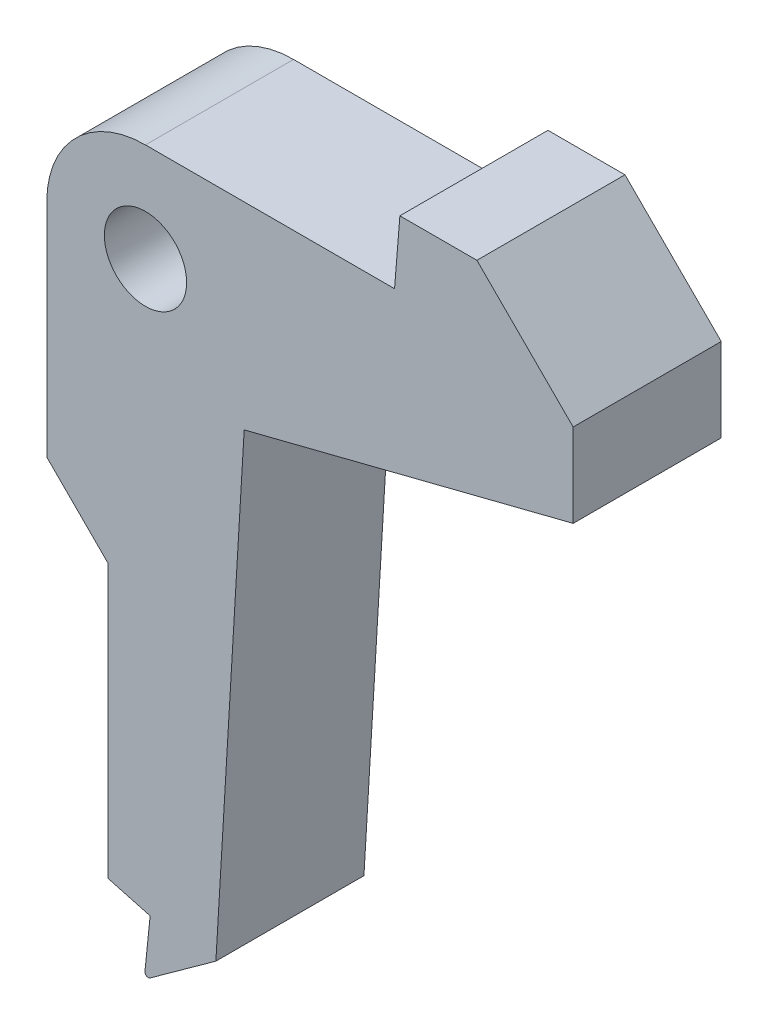
ISO-10303-21;
HEADER;
FILE_DESCRIPTION(('STEP AP214'),'2;1');
FILE_NAME('part.step','',(''),(''),'','','');
FILE_SCHEMA(('AUTOMOTIVE_DESIGN { 1 0 10303 214 1 1 1 1 }'));
ENDSEC;
DATA;
#1=APPLICATION_CONTEXT('core data for automotive mechanical design processes');
#2=APPLICATION_PROTOCOL_DEFINITION('international standard','automotive_design',2000,#1);
#3=PRODUCT_CONTEXT('',#1,'mechanical');
#4=PRODUCT('Part','Part','',(#3));
#5=PRODUCT_RELATED_PRODUCT_CATEGORY('part','',(#4));
#6=PRODUCT_DEFINITION_FORMATION('','',#4);
#7=PRODUCT_DEFINITION_CONTEXT('part definition',#1,'design');
#8=PRODUCT_DEFINITION('design','',#6,#7);
#9=PRODUCT_DEFINITION_SHAPE('','',#8);
#10=(LENGTH_UNIT() NAMED_UNIT(*) SI_UNIT(.MILLI.,.METRE.));
#11=(NAMED_UNIT(*) PLANE_ANGLE_UNIT() SI_UNIT($,.RADIAN.));
#12=(NAMED_UNIT(*) SI_UNIT($,.STERADIAN.) SOLID_ANGLE_UNIT());
#13=UNCERTAINTY_MEASURE_WITH_UNIT(LENGTH_MEASURE(1.E-05),#10,'distance_accuracy_value','');
#14=(GEOMETRIC_REPRESENTATION_CONTEXT(3) GLOBAL_UNCERTAINTY_ASSIGNED_CONTEXT((#13)) GLOBAL_UNIT_ASSIGNED_CONTEXT((#10,
#11,#12)) REPRESENTATION_CONTEXT('',''));
#15=CARTESIAN_POINT('',(0.,0.,0.));
#16=DIRECTION('',(0.,0.,1.));
#17=DIRECTION('',(1.,0.,0.));
#18=AXIS2_PLACEMENT_3D('',#15,#16,#17);
#19=CARTESIAN_POINT('',(0.165744471845361,-37.546161772189,9.));
#20=DIRECTION('',(0.,0.,-1.));
#21=DIRECTION('',(-1.,0.,0.));
#22=AXIS2_PLACEMENT_3D('',#19,#20,#21);
#23=CYLINDRICAL_SURFACE('',#22,0.200000000000002);
#24=CARTESIAN_POINT('',(0.165744471845361,-37.546161772189,0.));
#25=DIRECTION('',(0.,0.,1.));
#26=DIRECTION('',(1.,0.,0.));
#27=AXIS2_PLACEMENT_3D('',#24,#25,#26);
#28=CIRCLE('',#27,0.200000000000002);
#29=CARTESIAN_POINT('',(0.282693741661826,-37.708405010228,0.));
#30=VERTEX_POINT('',#29);
#31=CARTESIAN_POINT('',(-0.0332151986715307,-37.5257890083163,0.));
#32=VERTEX_POINT('',#31);
#33=EDGE_CURVE('E174',#30,#32,#28,.F.);
#34=ORIENTED_EDGE('',*,*,#33,.F.);
#35=DIRECTION('',(0.,0.,-1.));
#36=VECTOR('',#35,1.);
#37=CARTESIAN_POINT('',(0.282693741661826,-37.708405010228,9.));
#38=LINE('',#37,#36);
#39=CARTESIAN_POINT('',(0.282693741661826,-37.708405010228,9.));
#40=VERTEX_POINT('',#39);
#41=EDGE_CURVE('E11',#40,#30,#38,.T.);
#42=ORIENTED_EDGE('',*,*,#41,.F.);
#43=CARTESIAN_POINT('',(0.165744471845361,-37.546161772189,9.));
#44=DIRECTION('',(0.,0.,1.));
#45=DIRECTION('',(1.,0.,0.));
#46=AXIS2_PLACEMENT_3D('',#43,#44,#45);
#47=CIRCLE('',#46,0.200000000000002);
#48=CARTESIAN_POINT('',(-0.0332151986715307,-37.5257890083163,9.));
#49=VERTEX_POINT('',#48);
#50=EDGE_CURVE('E218',#40,#49,#47,.F.);
#51=ORIENTED_EDGE('',*,*,#50,.T.);
#52=DIRECTION('',(0.,0.,-1.));
#53=VECTOR('',#52,1.);
#54=CARTESIAN_POINT('',(-0.0332151986715307,-37.5257890083163,9.));
#55=LINE('',#54,#53);
#56=EDGE_CURVE('E51',#49,#32,#55,.T.);
#57=ORIENTED_EDGE('',*,*,#56,.T.);
#58=EDGE_LOOP('',(#34,#42,#51,#57));
#59=FACE_BOUND('',#58,.T.);
#60=ADVANCED_FACE('F35',(#59),#23,.T.);
#61=CARTESIAN_POINT('',(17.9838580516178,-24.9489318514621,9.));
#62=DIRECTION('',(0.584746349082306,-0.811216190195261,0.));
#63=DIRECTION('',(0.811216190195261,0.584746349082306,0.));
#64=AXIS2_PLACEMENT_3D('',#61,#62,#63);
#65=PLANE('',#64);
#66=DIRECTION('',(-0.811216190195261,-0.584746349082306,0.));
#67=VECTOR('',#66,1.);
#68=CARTESIAN_POINT('',(17.9838580516178,-24.9489318514621,0.));
#69=LINE('',#68,#67);
#70=CARTESIAN_POINT('',(4.27839011788118,-34.8282000830147,0.));
#71=VERTEX_POINT('',#70);
#72=EDGE_CURVE('E176',#71,#30,#69,.T.);
#73=ORIENTED_EDGE('',*,*,#72,.F.);
#74=DIRECTION('',(0.,0.,-1.));
#75=VECTOR('',#74,1.);
#76=CARTESIAN_POINT('',(4.27839011788118,-34.8282000830147,9.));
#77=LINE('',#76,#75);
#78=CARTESIAN_POINT('',(4.27839011788118,-34.8282000830147,9.));
#79=VERTEX_POINT('',#78);
#80=EDGE_CURVE('E43',#79,#71,#77,.T.);
#81=ORIENTED_EDGE('',*,*,#80,.F.);
#82=DIRECTION('',(-0.811216190195261,-0.584746349082306,0.));
#83=VECTOR('',#82,1.);
#84=CARTESIAN_POINT('',(17.9838580516178,-24.9489318514621,9.));
#85=LINE('',#84,#83);
#86=EDGE_CURVE('E262',#79,#40,#85,.T.);
#87=ORIENTED_EDGE('',*,*,#86,.T.);
#88=ORIENTED_EDGE('',*,*,#41,.T.);
#89=EDGE_LOOP('',(#73,#81,#87,#88));
#90=FACE_BOUND('',#89,.T.);
#91=ADVANCED_FACE('F249',(#90),#65,.T.);
#92=CARTESIAN_POINT('',(6.33572192455357,-0.378367065729331,9.));
#93=DIRECTION('',(0.998221537653518,-0.0596134361083714,0.));
#94=DIRECTION('',(0.0596134361083714,0.998221537653518,0.));
#95=AXIS2_PLACEMENT_3D('',#92,#93,#94);
#96=PLANE('',#95);
#97=DIRECTION('',(-0.0596134361083714,-0.998221537653518,0.));
#98=VECTOR('',#97,1.);
#99=CARTESIAN_POINT('',(6.33572192455357,-0.378367065729331,0.));
#100=LINE('',#99,#98);
#101=CARTESIAN_POINT('',(6.,-6.,0.));
#102=VERTEX_POINT('',#101);
#103=EDGE_CURVE('E179',#102,#71,#100,.T.);
#104=ORIENTED_EDGE('',*,*,#103,.F.);
#105=DIRECTION('',(0.,0.,-1.));
#106=VECTOR('',#105,1.);
#107=CARTESIAN_POINT('',(6.,-6.,9.));
#108=LINE('',#107,#106);
#109=CARTESIAN_POINT('',(6.,-6.,9.));
#110=VERTEX_POINT('',#109);
#111=EDGE_CURVE('E238',#110,#102,#108,.T.);
#112=ORIENTED_EDGE('',*,*,#111,.F.);
#113=DIRECTION('',(-0.0596134361083714,-0.998221537653518,0.));
#114=VECTOR('',#113,1.);
#115=CARTESIAN_POINT('',(6.33572192455357,-0.378367065729331,9.));
#116=LINE('',#115,#114);
#117=EDGE_CURVE('E245',#110,#79,#116,.T.);
#118=ORIENTED_EDGE('',*,*,#117,.T.);
#119=ORIENTED_EDGE('',*,*,#80,.T.);
#120=EDGE_LOOP('',(#104,#112,#118,#119));
#121=FACE_BOUND('',#120,.T.);
#122=ADVANCED_FACE('F243',(#121),#96,.T.);
#123=CARTESIAN_POINT('',(1.79375265795441,-7.06755053438896,9.));
#124=DIRECTION('',(0.246001714690068,-0.969269393084062,0.));
#125=DIRECTION('',(0.969269393084062,0.246001714690068,0.));
#126=AXIS2_PLACEMENT_3D('',#123,#124,#125);
#127=PLANE('',#126);
#128=DIRECTION('',(-0.969269393084062,-0.246001714690068,0.));
#129=VECTOR('',#128,1.);
#130=CARTESIAN_POINT('',(1.79375265795441,-7.06755053438896,0.));
#131=LINE('',#130,#129);
#132=CARTESIAN_POINT('',(25.9952904843054,-0.925171701528675,0.));
#133=VERTEX_POINT('',#132);
#134=EDGE_CURVE('E182',#133,#102,#131,.T.);
#135=ORIENTED_EDGE('',*,*,#134,.F.);
#136=DIRECTION('',(0.,0.,-1.));
#137=VECTOR('',#136,1.);
#138=CARTESIAN_POINT('',(25.9952904843054,-0.925171701528675,9.));
#139=LINE('',#138,#137);
#140=CARTESIAN_POINT('',(25.9952904843054,-0.925171701528675,9.));
#141=VERTEX_POINT('',#140);
#142=EDGE_CURVE('E236',#141,#133,#139,.T.);
#143=ORIENTED_EDGE('',*,*,#142,.F.);
#144=DIRECTION('',(-0.969269393084062,-0.246001714690068,0.));
#145=VECTOR('',#144,1.);
#146=CARTESIAN_POINT('',(1.79375265795441,-7.06755053438896,9.));
#147=LINE('',#146,#145);
#148=EDGE_CURVE('E259',#141,#110,#147,.T.);
#149=ORIENTED_EDGE('',*,*,#148,.T.);
#150=ORIENTED_EDGE('',*,*,#111,.T.);
#151=EDGE_LOOP('',(#135,#143,#149,#150));
#152=FACE_BOUND('',#151,.T.);
#153=ADVANCED_FACE('F256',(#152),#127,.T.);
#154=CARTESIAN_POINT('',(25.9952904843054,1.7771888235724E-13,9.));
#155=DIRECTION('',(1.,0.,0.));
#156=DIRECTION('',(0.,1.,0.));
#157=AXIS2_PLACEMENT_3D('',#154,#155,#156);
#158=PLANE('',#157);
#159=DIRECTION('',(0.,-1.,0.));
#160=VECTOR('',#159,1.);
#161=CARTESIAN_POINT('',(25.9952904843054,1.7771888235724E-13,0.));
#162=LINE('',#161,#160);
#163=CARTESIAN_POINT('',(25.9952904843053,4.14965659694265,0.));
#164=VERTEX_POINT('',#163);
#165=EDGE_CURVE('E185',#164,#133,#162,.T.);
#166=ORIENTED_EDGE('',*,*,#165,.F.);
#167=DIRECTION('',(0.,0.,-1.));
#168=VECTOR('',#167,1.);
#169=CARTESIAN_POINT('',(25.9952904843053,4.14965659694265,9.));
#170=LINE('',#169,#168);
#171=CARTESIAN_POINT('',(25.9952904843053,4.14965659694265,9.));
#172=VERTEX_POINT('',#171);
#173=EDGE_CURVE('E234',#172,#164,#170,.T.);
#174=ORIENTED_EDGE('',*,*,#173,.F.);
#175=DIRECTION('',(0.,-1.,0.));
#176=VECTOR('',#175,1.);
#177=CARTESIAN_POINT('',(25.9952904843054,1.7771888235724E-13,9.));
#178=LINE('',#177,#176);
#179=EDGE_CURVE('E264',#172,#141,#178,.T.);
#180=ORIENTED_EDGE('',*,*,#179,.T.);
#181=ORIENTED_EDGE('',*,*,#142,.T.);
#182=EDGE_LOOP('',(#166,#174,#180,#181));
#183=FACE_BOUND('',#182,.T.);
#184=ADVANCED_FACE('F312',(#183),#158,.T.);
#185=CARTESIAN_POINT('',(15.072473540624,15.072473540624,9.));
#186=DIRECTION('',(0.707106781186547,0.707106781186548,0.));
#187=DIRECTION('',(-0.707106781186548,0.707106781186547,0.));
#188=AXIS2_PLACEMENT_3D('',#185,#186,#187);
#189=PLANE('',#188);
#190=DIRECTION('',(0.707106781186548,-0.707106781186547,0.));
#191=VECTOR('',#190,1.);
#192=CARTESIAN_POINT('',(15.072473540624,15.072473540624,0.));
#193=LINE('',#192,#191);
#194=CARTESIAN_POINT('',(20.144947081248,10.,0.));
#195=VERTEX_POINT('',#194);
#196=EDGE_CURVE('E188',#195,#164,#193,.T.);
#197=ORIENTED_EDGE('',*,*,#196,.F.);
#198=DIRECTION('',(0.,0.,-1.));
#199=VECTOR('',#198,1.);
#200=CARTESIAN_POINT('',(20.144947081248,10.,9.));
#201=LINE('',#200,#199);
#202=CARTESIAN_POINT('',(20.144947081248,10.,9.));
#203=VERTEX_POINT('',#202);
#204=EDGE_CURVE('E232',#203,#195,#201,.T.);
#205=ORIENTED_EDGE('',*,*,#204,.F.);
#206=DIRECTION('',(0.707106781186548,-0.707106781186547,0.));
#207=VECTOR('',#206,1.);
#208=CARTESIAN_POINT('',(15.072473540624,15.072473540624,9.));
#209=LINE('',#208,#207);
#210=EDGE_CURVE('E270',#203,#172,#209,.T.);
#211=ORIENTED_EDGE('',*,*,#210,.T.);
#212=ORIENTED_EDGE('',*,*,#173,.T.);
#213=EDGE_LOOP('',(#197,#205,#211,#212));
#214=FACE_BOUND('',#213,.T.);
#215=ADVANCED_FACE('F315',(#214),#189,.T.);
#216=CARTESIAN_POINT('',(0.,10.,9.));
#217=DIRECTION('',(0.,1.,0.));
#218=DIRECTION('',(0.,0.,1.));
#219=AXIS2_PLACEMENT_3D('',#216,#217,#218);
#220=PLANE('',#219);
#221=DIRECTION('',(1.,0.,0.));
#222=VECTOR('',#221,1.);
#223=CARTESIAN_POINT('',(0.,10.,0.));
#224=LINE('',#223,#222);
#225=CARTESIAN_POINT('',(15.4624481322685,10.,0.));
#226=VERTEX_POINT('',#225);
#227=EDGE_CURVE('E191',#226,#195,#224,.T.);
#228=ORIENTED_EDGE('',*,*,#227,.F.);
#229=DIRECTION('',(0.,0.,-1.));
#230=VECTOR('',#229,1.);
#231=CARTESIAN_POINT('',(15.4624481322685,10.,9.));
#232=LINE('',#231,#230);
#233=CARTESIAN_POINT('',(15.4624481322685,10.,9.));
#234=VERTEX_POINT('',#233);
#235=EDGE_CURVE('E230',#234,#226,#232,.T.);
#236=ORIENTED_EDGE('',*,*,#235,.F.);
#237=DIRECTION('',(1.,0.,0.));
#238=VECTOR('',#237,1.);
#239=CARTESIAN_POINT('',(0.,10.,9.));
#240=LINE('',#239,#238);
#241=EDGE_CURVE('E273',#234,#203,#240,.T.);
#242=ORIENTED_EDGE('',*,*,#241,.T.);
#243=ORIENTED_EDGE('',*,*,#204,.T.);
#244=EDGE_LOOP('',(#228,#236,#242,#243));
#245=FACE_BOUND('',#244,.T.);
#246=ADVANCED_FACE('F319',(#245),#220,.T.);
#247=CARTESIAN_POINT('',(14.5561035103779,-1.18003609474193,9.));
#248=DIRECTION('',(-0.996730087833297,0.0808030445455417,0.));
#249=DIRECTION('',(-0.0808030445455417,-0.996730087833297,0.));
#250=AXIS2_PLACEMENT_3D('',#247,#248,#249);
#251=PLANE('',#250);
#252=DIRECTION('',(0.0808030445455417,0.996730087833297,0.));
#253=VECTOR('',#252,1.);
#254=CARTESIAN_POINT('',(14.5561035103779,-1.18003609474193,0.));
#255=LINE('',#254,#253);
#256=CARTESIAN_POINT('',(15.1381756114251,6.,0.));
#257=VERTEX_POINT('',#256);
#258=EDGE_CURVE('E194',#257,#226,#255,.T.);
#259=ORIENTED_EDGE('',*,*,#258,.F.);
#260=DIRECTION('',(0.,0.,-1.));
#261=VECTOR('',#260,1.);
#262=CARTESIAN_POINT('',(15.1381756114251,6.,9.));
#263=LINE('',#262,#261);
#264=CARTESIAN_POINT('',(15.1381756114251,6.,9.));
#265=VERTEX_POINT('',#264);
#266=EDGE_CURVE('E228',#265,#257,#263,.T.);
#267=ORIENTED_EDGE('',*,*,#266,.F.);
#268=DIRECTION('',(0.0808030445455417,0.996730087833297,0.));
#269=VECTOR('',#268,1.);
#270=CARTESIAN_POINT('',(14.5561035103779,-1.18003609474193,9.));
#271=LINE('',#270,#269);
#272=EDGE_CURVE('E276',#265,#234,#271,.T.);
#273=ORIENTED_EDGE('',*,*,#272,.T.);
#274=ORIENTED_EDGE('',*,*,#235,.T.);
#275=EDGE_LOOP('',(#259,#267,#273,#274));
#276=FACE_BOUND('',#275,.T.);
#277=ADVANCED_FACE('F323',(#276),#251,.T.);
#278=CARTESIAN_POINT('',(0.,6.,9.));
#279=DIRECTION('',(0.,1.,0.));
#280=DIRECTION('',(0.,0.,1.));
#281=AXIS2_PLACEMENT_3D('',#278,#279,#280);
#282=PLANE('',#281);
#283=DIRECTION('',(1.,0.,0.));
#284=VECTOR('',#283,1.);
#285=CARTESIAN_POINT('',(0.,6.,0.));
#286=LINE('',#285,#284);
#287=CARTESIAN_POINT('',(0.,6.,0.));
#288=VERTEX_POINT('',#287);
#289=EDGE_CURVE('E197',#288,#257,#286,.T.);
#290=ORIENTED_EDGE('',*,*,#289,.F.);
#291=DIRECTION('',(0.,0.,-1.));
#292=VECTOR('',#291,1.);
#293=CARTESIAN_POINT('',(0.,6.,9.));
#294=LINE('',#293,#292);
#295=CARTESIAN_POINT('',(0.,6.,9.));
#296=VERTEX_POINT('',#295);
#297=EDGE_CURVE('E226',#296,#288,#294,.T.);
#298=ORIENTED_EDGE('',*,*,#297,.F.);
#299=DIRECTION('',(1.,0.,0.));
#300=VECTOR('',#299,1.);
#301=CARTESIAN_POINT('',(0.,6.,9.));
#302=LINE('',#301,#300);
#303=EDGE_CURVE('E279',#296,#265,#302,.T.);
#304=ORIENTED_EDGE('',*,*,#303,.T.);
#305=ORIENTED_EDGE('',*,*,#266,.T.);
#306=EDGE_LOOP('',(#290,#298,#304,#305));
#307=FACE_BOUND('',#306,.T.);
#308=ADVANCED_FACE('F327',(#307),#282,.T.);
#309=CARTESIAN_POINT('',(0.,0.,9.));
#310=DIRECTION('',(0.,0.,-1.));
#311=DIRECTION('',(-1.,0.,0.));
#312=AXIS2_PLACEMENT_3D('',#309,#310,#311);
#313=CYLINDRICAL_SURFACE('',#312,6.);
#314=CARTESIAN_POINT('',(0.,0.,0.));
#315=DIRECTION('',(0.,0.,1.));
#316=DIRECTION('',(1.,0.,0.));
#317=AXIS2_PLACEMENT_3D('',#314,#315,#316);
#318=CIRCLE('',#317,6.);
#319=CARTESIAN_POINT('',(-6.,0.,0.));
#320=VERTEX_POINT('',#319);
#321=EDGE_CURVE('E200',#288,#320,#318,.T.);
#322=ORIENTED_EDGE('',*,*,#321,.T.);
#323=DIRECTION('',(0.,0.,-1.));
#324=VECTOR('',#323,1.);
#325=CARTESIAN_POINT('',(-6.,0.,9.));
#326=LINE('',#325,#324);
#327=CARTESIAN_POINT('',(-6.,0.,9.));
#328=VERTEX_POINT('',#327);
#329=EDGE_CURVE('E224',#328,#320,#326,.T.);
#330=ORIENTED_EDGE('',*,*,#329,.F.);
#331=CARTESIAN_POINT('',(0.,0.,9.));
#332=DIRECTION('',(0.,0.,1.));
#333=DIRECTION('',(1.,0.,0.));
#334=AXIS2_PLACEMENT_3D('',#331,#332,#333);
#335=CIRCLE('',#334,6.);
#336=EDGE_CURVE('E282',#296,#328,#335,.T.);
#337=ORIENTED_EDGE('',*,*,#336,.F.);
#338=ORIENTED_EDGE('',*,*,#297,.T.);
#339=EDGE_LOOP('',(#322,#330,#337,#338));
#340=FACE_BOUND('',#339,.T.);
#341=ADVANCED_FACE('F331',(#340),#313,.T.);
#342=CARTESIAN_POINT('',(-6.,0.,9.));
#343=DIRECTION('',(-1.,0.,0.));
#344=DIRECTION('',(0.,0.,1.));
#345=AXIS2_PLACEMENT_3D('',#342,#343,#344);
#346=PLANE('',#345);
#347=DIRECTION('',(0.,1.,0.));
#348=VECTOR('',#347,1.);
#349=CARTESIAN_POINT('',(-6.,0.,0.));
#350=LINE('',#349,#348);
#351=CARTESIAN_POINT('',(-6.,-13.4332762829089,0.));
#352=VERTEX_POINT('',#351);
#353=EDGE_CURVE('E203',#352,#320,#350,.T.);
#354=ORIENTED_EDGE('',*,*,#353,.F.);
#355=DIRECTION('',(0.,0.,-1.));
#356=VECTOR('',#355,1.);
#357=CARTESIAN_POINT('',(-6.,-13.4332762829089,9.));
#358=LINE('',#357,#356);
#359=CARTESIAN_POINT('',(-6.,-13.4332762829089,9.));
#360=VERTEX_POINT('',#359);
#361=EDGE_CURVE('E222',#360,#352,#358,.T.);
#362=ORIENTED_EDGE('',*,*,#361,.F.);
#363=DIRECTION('',(0.,1.,0.));
#364=VECTOR('',#363,1.);
#365=CARTESIAN_POINT('',(-6.,0.,9.));
#366=LINE('',#365,#364);
#367=EDGE_CURVE('E284',#360,#328,#366,.T.);
#368=ORIENTED_EDGE('',*,*,#367,.T.);
#369=ORIENTED_EDGE('',*,*,#329,.T.);
#370=EDGE_LOOP('',(#354,#362,#368,#369));
#371=FACE_BOUND('',#370,.T.);
#372=ADVANCED_FACE('F335',(#371),#346,.T.);
#373=CARTESIAN_POINT('',(-9.71663814145445,-9.71663814145445,9.));
#374=DIRECTION('',(-0.707106781186547,-0.707106781186547,0.));
#375=DIRECTION('',(0.707106781186548,-0.707106781186548,0.));
#376=AXIS2_PLACEMENT_3D('',#373,#374,#375);
#377=PLANE('',#376);
#378=DIRECTION('',(-0.707106781186548,0.707106781186548,0.));
#379=VECTOR('',#378,1.);
#380=CARTESIAN_POINT('',(-9.71663814145445,-9.71663814145445,0.));
#381=LINE('',#380,#379);
#382=CARTESIAN_POINT('',(-2.27208982740734,-17.1611864555016,0.));
#383=VERTEX_POINT('',#382);
#384=EDGE_CURVE('E206',#383,#352,#381,.T.);
#385=ORIENTED_EDGE('',*,*,#384,.F.);
#386=DIRECTION('',(0.,0.,-1.));
#387=VECTOR('',#386,1.);
#388=CARTESIAN_POINT('',(-2.27208982740734,-17.1611864555016,9.));
#389=LINE('',#388,#387);
#390=CARTESIAN_POINT('',(-2.27208982740734,-17.1611864555016,9.));
#391=VERTEX_POINT('',#390);
#392=EDGE_CURVE('E152',#391,#383,#389,.T.);
#393=ORIENTED_EDGE('',*,*,#392,.F.);
#394=DIRECTION('',(-0.707106781186548,0.707106781186548,0.));
#395=VECTOR('',#394,1.);
#396=CARTESIAN_POINT('',(-9.71663814145445,-9.71663814145445,9.));
#397=LINE('',#396,#395);
#398=EDGE_CURVE('E163',#391,#360,#397,.T.);
#399=ORIENTED_EDGE('',*,*,#398,.T.);
#400=ORIENTED_EDGE('',*,*,#361,.T.);
#401=EDGE_LOOP('',(#385,#393,#399,#400));
#402=FACE_BOUND('',#401,.T.);
#403=ADVANCED_FACE('F288',(#402),#377,.T.);
#404=CARTESIAN_POINT('',(-2.27208982740734,0.,9.));
#405=DIRECTION('',(-1.,0.,0.));
#406=DIRECTION('',(0.,0.,1.));
#407=AXIS2_PLACEMENT_3D('',#404,#405,#406);
#408=PLANE('',#407);
#409=DIRECTION('',(0.,1.,0.));
#410=VECTOR('',#409,1.);
#411=CARTESIAN_POINT('',(-2.27208982740734,0.,0.));
#412=LINE('',#411,#410);
#413=CARTESIAN_POINT('',(-2.27208982740734,-33.7477038311711,0.));
#414=VERTEX_POINT('',#413);
#415=EDGE_CURVE('E148',#414,#383,#412,.T.);
#416=ORIENTED_EDGE('',*,*,#415,.F.);
#417=DIRECTION('',(0.,0.,-1.));
#418=VECTOR('',#417,1.);
#419=CARTESIAN_POINT('',(-2.27208982740734,-33.7477038311711,9.));
#420=LINE('',#419,#418);
#421=CARTESIAN_POINT('',(-2.27208982740734,-33.7477038311711,9.));
#422=VERTEX_POINT('',#421);
#423=EDGE_CURVE('E143',#422,#414,#420,.T.);
#424=ORIENTED_EDGE('',*,*,#423,.F.);
#425=DIRECTION('',(0.,1.,0.));
#426=VECTOR('',#425,1.);
#427=CARTESIAN_POINT('',(-2.27208982740734,0.,9.));
#428=LINE('',#427,#426);
#429=EDGE_CURVE('E146',#422,#391,#428,.T.);
#430=ORIENTED_EDGE('',*,*,#429,.T.);
#431=ORIENTED_EDGE('',*,*,#392,.T.);
#432=EDGE_LOOP('',(#416,#424,#430,#431));
#433=FACE_BOUND('',#432,.T.);
#434=ADVANCED_FACE('F145',(#433),#408,.T.);
#435=CARTESIAN_POINT('',(-8.68180708409066,-32.0092062154696,9.));
#436=DIRECTION('',(-0.261770728516274,-0.965130087445241,0.));
#437=DIRECTION('',(0.965130087445241,-0.261770728516274,0.));
#438=AXIS2_PLACEMENT_3D('',#435,#436,#437);
#439=PLANE('',#438);
#440=DIRECTION('',(-0.965130087445241,0.261770728516274,0.));
#441=VECTOR('',#440,1.);
#442=CARTESIAN_POINT('',(-8.68180708409066,-32.0092062154696,0.));
#443=LINE('',#442,#441);
#444=CARTESIAN_POINT('',(0.282693741661824,-34.4406337944747,0.));
#445=VERTEX_POINT('',#444);
#446=EDGE_CURVE('E210',#445,#414,#443,.T.);
#447=ORIENTED_EDGE('',*,*,#446,.F.);
#448=DIRECTION('',(0.,0.,-1.));
#449=VECTOR('',#448,1.);
#450=CARTESIAN_POINT('',(0.282693741661824,-34.4406337944747,9.));
#451=LINE('',#450,#449);
#452=CARTESIAN_POINT('',(0.282693741661824,-34.4406337944747,9.));
#453=VERTEX_POINT('',#452);
#454=EDGE_CURVE('E97',#453,#445,#451,.T.);
#455=ORIENTED_EDGE('',*,*,#454,.F.);
#456=DIRECTION('',(-0.965130087445241,0.261770728516274,0.));
#457=VECTOR('',#456,1.);
#458=CARTESIAN_POINT('',(-8.68180708409066,-32.0092062154696,9.));
#459=LINE('',#458,#457);
#460=EDGE_CURVE('E160',#453,#422,#459,.T.);
#461=ORIENTED_EDGE('',*,*,#460,.T.);
#462=ORIENTED_EDGE('',*,*,#423,.T.);
#463=EDGE_LOOP('',(#447,#455,#461,#462));
#464=FACE_BOUND('',#463,.T.);
#465=ADVANCED_FACE('F165',(#464),#439,.T.);
#466=CARTESIAN_POINT('',(3.7697662408483,-0.38601067884942,9.));
#467=DIRECTION('',(-0.994798352584449,0.101863819363239,0.));
#468=DIRECTION('',(-0.101863819363239,-0.994798352584449,0.));
#469=AXIS2_PLACEMENT_3D('',#466,#467,#468);
#470=PLANE('',#469);
#471=DIRECTION('',(0.101863819363239,0.994798352584449,0.));
#472=VECTOR('',#471,1.);
#473=CARTESIAN_POINT('',(3.7697662408483,-0.38601067884942,0.));
#474=LINE('',#473,#472);
#475=EDGE_CURVE('E212',#32,#445,#474,.T.);
#476=ORIENTED_EDGE('',*,*,#475,.F.);
#477=ORIENTED_EDGE('',*,*,#56,.F.);
#478=DIRECTION('',(0.101863819363239,0.994798352584449,0.));
#479=VECTOR('',#478,1.);
#480=CARTESIAN_POINT('',(3.7697662408483,-0.38601067884942,9.));
#481=LINE('',#480,#479);
#482=EDGE_CURVE('E166',#49,#453,#481,.T.);
#483=ORIENTED_EDGE('',*,*,#482,.T.);
#484=ORIENTED_EDGE('',*,*,#454,.T.);
#485=EDGE_LOOP('',(#476,#477,#483,#484));
#486=FACE_BOUND('',#485,.T.);
#487=ADVANCED_FACE('F290',(#486),#470,.T.);
#488=CARTESIAN_POINT('',(0.,0.,9.));
#489=DIRECTION('',(0.,0.,-1.));
#490=DIRECTION('',(-1.,0.,0.));
#491=AXIS2_PLACEMENT_3D('',#488,#489,#490);
#492=CYLINDRICAL_SURFACE('',#491,2.5);
#493=CARTESIAN_POINT('',(0.,0.,9.));
#494=DIRECTION('',(0.,0.,1.));
#495=DIRECTION('',(1.,0.,0.));
#496=AXIS2_PLACEMENT_3D('',#493,#494,#495);
#497=CIRCLE('',#496,2.5);
#498=CARTESIAN_POINT('',(2.5,0.,9.));
#499=VERTEX_POINT('',#498);
#500=EDGE_CURVE('E168',#499,#499,#497,.T.);
#501=ORIENTED_EDGE('',*,*,#500,.T.);
#502=EDGE_LOOP('',(#501));
#503=FACE_BOUND('',#502,.T.);
#504=CARTESIAN_POINT('',(0.,0.,0.));
#505=DIRECTION('',(0.,0.,1.));
#506=DIRECTION('',(1.,0.,0.));
#507=AXIS2_PLACEMENT_3D('',#504,#505,#506);
#508=CIRCLE('',#507,2.5);
#509=CARTESIAN_POINT('',(2.5,0.,0.));
#510=VERTEX_POINT('',#509);
#511=EDGE_CURVE('E215',#510,#510,#508,.T.);
#512=ORIENTED_EDGE('',*,*,#511,.F.);
#513=EDGE_LOOP('',(#512));
#514=FACE_BOUND('',#513,.T.);
#515=ADVANCED_FACE('F292',(#503,#514),#492,.F.);
#516=CARTESIAN_POINT('',(0.,0.,9.));
#517=DIRECTION('',(0.,0.,1.));
#518=DIRECTION('',(1.,0.,0.));
#519=AXIS2_PLACEMENT_3D('',#516,#517,#518);
#520=PLANE('',#519);
#521=ORIENTED_EDGE('',*,*,#50,.F.);
#522=ORIENTED_EDGE('',*,*,#86,.F.);
#523=ORIENTED_EDGE('',*,*,#117,.F.);
#524=ORIENTED_EDGE('',*,*,#148,.F.);
#525=ORIENTED_EDGE('',*,*,#179,.F.);
#526=ORIENTED_EDGE('',*,*,#210,.F.);
#527=ORIENTED_EDGE('',*,*,#241,.F.);
#528=ORIENTED_EDGE('',*,*,#272,.F.);
#529=ORIENTED_EDGE('',*,*,#303,.F.);
#530=ORIENTED_EDGE('',*,*,#336,.T.);
#531=ORIENTED_EDGE('',*,*,#367,.F.);
#532=ORIENTED_EDGE('',*,*,#398,.F.);
#533=ORIENTED_EDGE('',*,*,#429,.F.);
#534=ORIENTED_EDGE('',*,*,#460,.F.);
#535=ORIENTED_EDGE('',*,*,#482,.F.);
#536=EDGE_LOOP('',(#521,#522,#523,#524,#525,#526,#527,#528,#529,#530,#531,#532,#533,#534,#535));
#537=FACE_BOUND('',#536,.T.);
#538=ORIENTED_EDGE('',*,*,#500,.F.);
#539=EDGE_LOOP('',(#538));
#540=FACE_BOUND('',#539,.T.);
#541=ADVANCED_FACE('F157',(#537,#540),#520,.T.);
#542=CARTESIAN_POINT('',(0.,0.,0.));
#543=DIRECTION('',(0.,0.,1.));
#544=DIRECTION('',(1.,0.,0.));
#545=AXIS2_PLACEMENT_3D('',#542,#543,#544);
#546=PLANE('',#545);
#547=ORIENTED_EDGE('',*,*,#33,.T.);
#548=ORIENTED_EDGE('',*,*,#475,.T.);
#549=ORIENTED_EDGE('',*,*,#446,.T.);
#550=ORIENTED_EDGE('',*,*,#415,.T.);
#551=ORIENTED_EDGE('',*,*,#384,.T.);
#552=ORIENTED_EDGE('',*,*,#353,.T.);
#553=ORIENTED_EDGE('',*,*,#321,.F.);
#554=ORIENTED_EDGE('',*,*,#289,.T.);
#555=ORIENTED_EDGE('',*,*,#258,.T.);
#556=ORIENTED_EDGE('',*,*,#227,.T.);
#557=ORIENTED_EDGE('',*,*,#196,.T.);
#558=ORIENTED_EDGE('',*,*,#165,.T.);
#559=ORIENTED_EDGE('',*,*,#134,.T.);
#560=ORIENTED_EDGE('',*,*,#103,.T.);
#561=ORIENTED_EDGE('',*,*,#72,.T.);
#562=EDGE_LOOP('',(#547,#548,#549,#550,#551,#552,#553,#554,#555,#556,#557,#558,#559,#560,#561));
#563=FACE_BOUND('',#562,.T.);
#564=ORIENTED_EDGE('',*,*,#511,.T.);
#565=EDGE_LOOP('',(#564));
#566=FACE_BOUND('',#565,.T.);
#567=ADVANCED_FACE('F251',(#563,#566),#546,.F.);
#568=CLOSED_SHELL('',(#60,#91,#122,#153,#184,#215,#246,#277,#308,#341,#372,#403,#434,#465,#487,
#515,#541,#567));
#569=MANIFOLD_SOLID_BREP('B2',#568);
#570=ADVANCED_BREP_SHAPE_REPRESENTATION('',(#18,#569),#14);
#571=SHAPE_DEFINITION_REPRESENTATION(#9,#570);
ENDSEC;
END-ISO-10303-21;
